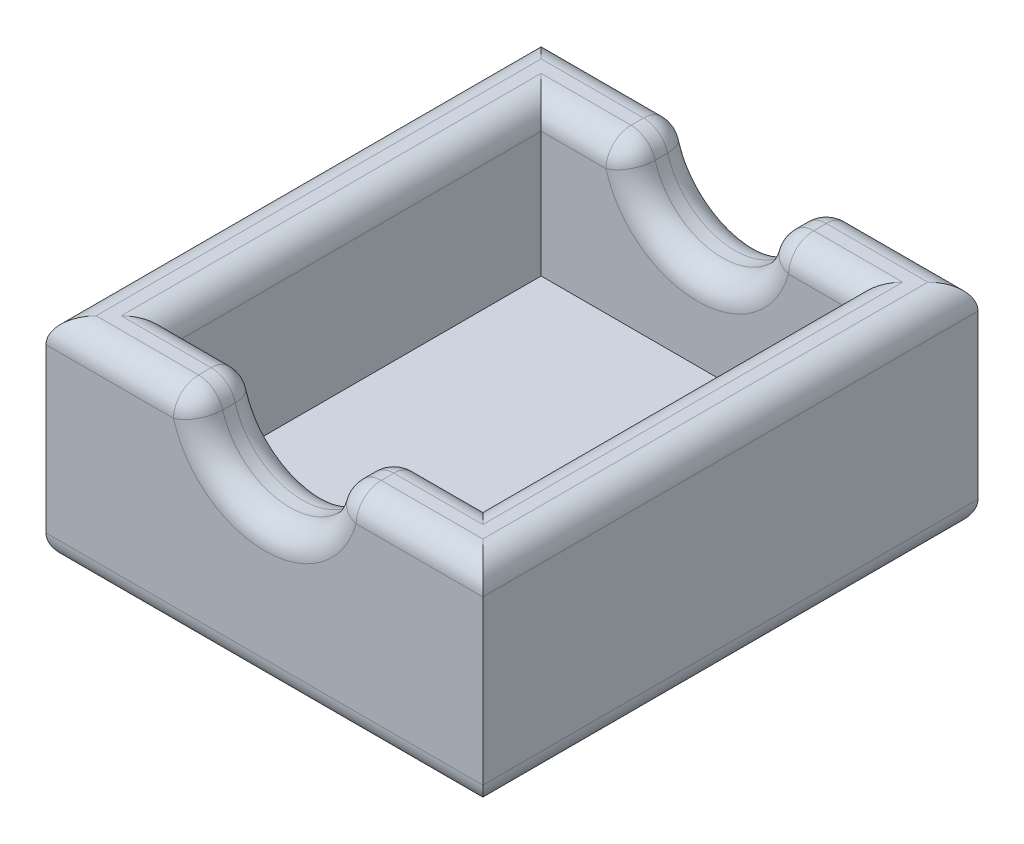
ISO-10303-21;
HEADER;
FILE_DESCRIPTION(('STEP AP214'),'2;1');
FILE_NAME('part.step','',(''),(''),'','','');
FILE_SCHEMA(('AUTOMOTIVE_DESIGN { 1 0 10303 214 1 1 1 1 }'));
ENDSEC;
DATA;
#1=APPLICATION_CONTEXT('core data for automotive mechanical design processes');
#2=APPLICATION_PROTOCOL_DEFINITION('international standard','automotive_design',2000,#1);
#3=PRODUCT_CONTEXT('',#1,'mechanical');
#4=PRODUCT('Part','Part','',(#3));
#5=PRODUCT_RELATED_PRODUCT_CATEGORY('part','',(#4));
#6=PRODUCT_DEFINITION_FORMATION('','',#4);
#7=PRODUCT_DEFINITION_CONTEXT('part definition',#1,'design');
#8=PRODUCT_DEFINITION('design','',#6,#7);
#9=PRODUCT_DEFINITION_SHAPE('','',#8);
#10=(LENGTH_UNIT() NAMED_UNIT(*) SI_UNIT(.MILLI.,.METRE.));
#11=(NAMED_UNIT(*) PLANE_ANGLE_UNIT() SI_UNIT($,.RADIAN.));
#12=(NAMED_UNIT(*) SI_UNIT($,.STERADIAN.) SOLID_ANGLE_UNIT());
#13=UNCERTAINTY_MEASURE_WITH_UNIT(LENGTH_MEASURE(1.E-05),#10,'distance_accuracy_value','');
#14=(GEOMETRIC_REPRESENTATION_CONTEXT(3) GLOBAL_UNCERTAINTY_ASSIGNED_CONTEXT((#13)) GLOBAL_UNIT_ASSIGNED_CONTEXT((#10,
#11,#12)) REPRESENTATION_CONTEXT('',''));
#15=CARTESIAN_POINT('',(0.,0.,0.));
#16=DIRECTION('',(0.,0.,1.));
#17=DIRECTION('',(1.,0.,0.));
#18=AXIS2_PLACEMENT_3D('',#15,#16,#17);
#19=CARTESIAN_POINT('',(0.,12.,0.));
#20=DIRECTION('',(0.,-1.,0.));
#21=DIRECTION('',(0.,0.,-1.));
#22=AXIS2_PLACEMENT_3D('',#19,#20,#21);
#23=PLANE('',#22);
#24=DIRECTION('',(1.,0.,0.));
#25=VECTOR('',#24,1.);
#26=CARTESIAN_POINT('',(0.,12.,31.5));
#27=LINE('',#26,#25);
#28=CARTESIAN_POINT('',(26.85,12.,31.5));
#29=VERTEX_POINT('',#28);
#30=CARTESIAN_POINT('',(19.7448525608543,12.,31.5));
#31=VERTEX_POINT('',#30);
#32=EDGE_CURVE('E307',#29,#31,#27,.F.);
#33=ORIENTED_EDGE('',*,*,#32,.T.);
#34=DIRECTION('',(0.,0.,1.));
#35=VECTOR('',#34,1.);
#36=CARTESIAN_POINT('',(19.7448525608543,12.,0.));
#37=LINE('',#36,#35);
#38=CARTESIAN_POINT('',(19.7448525608543,12.,32.5));
#39=VERTEX_POINT('',#38);
#40=EDGE_CURVE('E406',#31,#39,#37,.T.);
#41=ORIENTED_EDGE('',*,*,#40,.T.);
#42=DIRECTION('',(1.,0.,0.));
#43=VECTOR('',#42,1.);
#44=CARTESIAN_POINT('',(0.,12.,32.5));
#45=LINE('',#44,#43);
#46=CARTESIAN_POINT('',(27.85,12.,32.5));
#47=VERTEX_POINT('',#46);
#48=EDGE_CURVE('E286',#39,#47,#45,.T.);
#49=ORIENTED_EDGE('',*,*,#48,.T.);
#50=DIRECTION('',(0.,0.,-1.));
#51=VECTOR('',#50,1.);
#52=CARTESIAN_POINT('',(27.85,12.,0.));
#53=LINE('',#52,#51);
#54=CARTESIAN_POINT('',(27.85,12.,-3.));
#55=VERTEX_POINT('',#54);
#56=EDGE_CURVE('E291',#47,#55,#53,.T.);
#57=ORIENTED_EDGE('',*,*,#56,.T.);
#58=DIRECTION('',(-1.,0.,0.));
#59=VECTOR('',#58,1.);
#60=CARTESIAN_POINT('',(0.,12.,-3.));
#61=LINE('',#60,#59);
#62=CARTESIAN_POINT('',(19.7448525608543,12.,-3.));
#63=VERTEX_POINT('',#62);
#64=EDGE_CURVE('E279',#55,#63,#61,.T.);
#65=ORIENTED_EDGE('',*,*,#64,.T.);
#66=DIRECTION('',(0.,0.,1.));
#67=VECTOR('',#66,1.);
#68=CARTESIAN_POINT('',(19.7448525608543,12.,0.));
#69=LINE('',#68,#67);
#70=CARTESIAN_POINT('',(19.7448525608543,12.,-2.));
#71=VERTEX_POINT('',#70);
#72=EDGE_CURVE('E403',#63,#71,#69,.T.);
#73=ORIENTED_EDGE('',*,*,#72,.T.);
#74=DIRECTION('',(-1.,0.,0.));
#75=VECTOR('',#74,1.);
#76=CARTESIAN_POINT('',(24.85,12.,-2.));
#77=LINE('',#76,#75);
#78=CARTESIAN_POINT('',(26.85,12.,-2.));
#79=VERTEX_POINT('',#78);
#80=EDGE_CURVE('E298',#71,#79,#77,.F.);
#81=ORIENTED_EDGE('',*,*,#80,.T.);
#82=DIRECTION('',(0.,0.,-1.));
#83=VECTOR('',#82,1.);
#84=CARTESIAN_POINT('',(26.85,12.,29.5));
#85=LINE('',#84,#83);
#86=EDGE_CURVE('E303',#79,#29,#85,.F.);
#87=ORIENTED_EDGE('',*,*,#86,.T.);
#88=EDGE_LOOP('',(#33,#41,#49,#57,#65,#73,#81,#87));
#89=FACE_BOUND('',#88,.T.);
#90=ADVANCED_FACE('F41',(#89),#23,.F.);
#91=CARTESIAN_POINT('',(0.,10.,-2.));
#92=DIRECTION('',(1.,0.,0.));
#93=DIRECTION('',(0.,0.,-1.));
#94=AXIS2_PLACEMENT_3D('',#91,#92,#93);
#95=CYLINDRICAL_SURFACE('',#94,2.);
#96=ORIENTED_EDGE('',*,*,#80,.F.);
#97=CARTESIAN_POINT('',(19.7448525608543,10.,-2.));
#98=DIRECTION('',(1.,0.,0.));
#99=DIRECTION('',(0.,0.,-1.));
#100=AXIS2_PLACEMENT_3D('',#97,#98,#99);
#101=CIRCLE('',#100,2.);
#102=CARTESIAN_POINT('',(19.7448525608543,10.,0.));
#103=VERTEX_POINT('',#102);
#104=EDGE_CURVE('E432',#71,#103,#101,.T.);
#105=ORIENTED_EDGE('',*,*,#104,.T.);
#106=DIRECTION('',(-1.,0.,0.));
#107=VECTOR('',#106,1.);
#108=CARTESIAN_POINT('',(0.,10.,0.));
#109=LINE('',#108,#107);
#110=CARTESIAN_POINT('',(24.85,10.,0.));
#111=VERTEX_POINT('',#110);
#112=EDGE_CURVE('E314',#111,#103,#109,.T.);
#113=ORIENTED_EDGE('',*,*,#112,.F.);
#114=CARTESIAN_POINT('',(26.85,10.,-2.));
#115=DIRECTION('',(0.707106781186548,0.,0.707106781186547));
#116=DIRECTION('',(-0.707106781186547,0.,0.707106781186548));
#117=AXIS2_PLACEMENT_3D('',#114,#115,#116);
#118=ELLIPSE('',#117,2.82842712474619,2.);
#119=EDGE_CURVE('E347',#79,#111,#118,.T.);
#120=ORIENTED_EDGE('',*,*,#119,.F.);
#121=EDGE_LOOP('',(#96,#105,#113,#120));
#122=FACE_BOUND('',#121,.T.);
#123=ADVANCED_FACE('F644',(#122),#95,.T.);
#124=CARTESIAN_POINT('',(0.,10.,31.5));
#125=DIRECTION('',(-1.,0.,0.));
#126=DIRECTION('',(0.,0.,1.));
#127=AXIS2_PLACEMENT_3D('',#124,#125,#126);
#128=CYLINDRICAL_SURFACE('',#127,2.);
#129=CARTESIAN_POINT('',(5.17140882475201,12.,31.5));
#130=VERTEX_POINT('',#129);
#131=CARTESIAN_POINT('',(-1.99999999999999,12.,31.5));
#132=VERTEX_POINT('',#131);
#133=EDGE_CURVE('E306',#130,#132,#27,.F.);
#134=ORIENTED_EDGE('',*,*,#133,.F.);
#135=CARTESIAN_POINT('',(5.17140882475201,10.,31.5));
#136=DIRECTION('',(-1.,0.,0.));
#137=DIRECTION('',(0.,0.,1.));
#138=AXIS2_PLACEMENT_3D('',#135,#136,#137);
#139=CIRCLE('',#138,2.);
#140=CARTESIAN_POINT('',(5.17140882475201,10.,29.5));
#141=VERTEX_POINT('',#140);
#142=EDGE_CURVE('E394',#130,#141,#139,.T.);
#143=ORIENTED_EDGE('',*,*,#142,.T.);
#144=DIRECTION('',(1.,0.,0.));
#145=VECTOR('',#144,1.);
#146=CARTESIAN_POINT('',(24.85,10.,29.5));
#147=LINE('',#146,#145);
#148=CARTESIAN_POINT('',(0.,10.,29.5));
#149=VERTEX_POINT('',#148);
#150=EDGE_CURVE('E274',#149,#141,#147,.T.);
#151=ORIENTED_EDGE('',*,*,#150,.F.);
#152=CARTESIAN_POINT('',(-1.99999999999999,10.,31.5));
#153=DIRECTION('',(-0.707106781186548,0.,-0.707106781186547));
#154=DIRECTION('',(-0.707106781186547,0.,0.707106781186548));
#155=AXIS2_PLACEMENT_3D('',#152,#153,#154);
#156=ELLIPSE('',#155,2.82842712474619,2.);
#157=EDGE_CURVE('E342',#149,#132,#156,.F.);
#158=ORIENTED_EDGE('',*,*,#157,.T.);
#159=EDGE_LOOP('',(#134,#143,#151,#158));
#160=FACE_BOUND('',#159,.T.);
#161=ADVANCED_FACE('F688',(#160),#128,.T.);
#162=CARTESIAN_POINT('',(0.,10.,32.5));
#163=DIRECTION('',(1.,0.,0.));
#164=DIRECTION('',(0.,0.,-1.));
#165=AXIS2_PLACEMENT_3D('',#162,#163,#164);
#166=CYLINDRICAL_SURFACE('',#165,2.);
#167=ORIENTED_EDGE('',*,*,#48,.F.);
#168=CARTESIAN_POINT('',(19.7448525608543,10.,32.5));
#169=DIRECTION('',(1.,0.,0.));
#170=DIRECTION('',(0.,0.,-1.));
#171=AXIS2_PLACEMENT_3D('',#168,#169,#170);
#172=CIRCLE('',#171,2.);
#173=CARTESIAN_POINT('',(19.7448525608543,10.,34.5));
#174=VERTEX_POINT('',#173);
#175=EDGE_CURVE('E409',#39,#174,#172,.T.);
#176=ORIENTED_EDGE('',*,*,#175,.T.);
#177=DIRECTION('',(1.,0.,0.));
#178=VECTOR('',#177,1.);
#179=CARTESIAN_POINT('',(-5.,10.,34.5));
#180=LINE('',#179,#178);
#181=CARTESIAN_POINT('',(29.85,10.,34.5));
#182=VERTEX_POINT('',#181);
#183=EDGE_CURVE('E325',#182,#174,#180,.F.);
#184=ORIENTED_EDGE('',*,*,#183,.F.);
#185=CARTESIAN_POINT('',(27.85,10.,32.5));
#186=DIRECTION('',(0.707106781186547,0.,-0.707106781186548));
#187=DIRECTION('',(0.707106781186548,0.,0.707106781186547));
#188=AXIS2_PLACEMENT_3D('',#185,#186,#187);
#189=ELLIPSE('',#188,2.82842712474619,2.);
#190=EDGE_CURVE('E358',#47,#182,#189,.T.);
#191=ORIENTED_EDGE('',*,*,#190,.F.);
#192=EDGE_LOOP('',(#167,#176,#184,#191));
#193=FACE_BOUND('',#192,.T.);
#194=ADVANCED_FACE('F577',(#193),#166,.T.);
#195=CARTESIAN_POINT('',(0.,10.,-3.));
#196=DIRECTION('',(-1.,0.,0.));
#197=DIRECTION('',(0.,0.,1.));
#198=AXIS2_PLACEMENT_3D('',#195,#196,#197);
#199=CYLINDRICAL_SURFACE('',#198,2.);
#200=CARTESIAN_POINT('',(5.17140882475201,12.,-3.));
#201=VERTEX_POINT('',#200);
#202=CARTESIAN_POINT('',(-3.,12.,-3.));
#203=VERTEX_POINT('',#202);
#204=EDGE_CURVE('E278',#201,#203,#61,.T.);
#205=ORIENTED_EDGE('',*,*,#204,.F.);
#206=CARTESIAN_POINT('',(5.17140882475201,10.,-3.));
#207=DIRECTION('',(-1.,0.,0.));
#208=DIRECTION('',(0.,0.,1.));
#209=AXIS2_PLACEMENT_3D('',#206,#207,#208);
#210=CIRCLE('',#209,2.);
#211=CARTESIAN_POINT('',(5.17140882475201,10.,-5.));
#212=VERTEX_POINT('',#211);
#213=EDGE_CURVE('E441',#201,#212,#210,.T.);
#214=ORIENTED_EDGE('',*,*,#213,.T.);
#215=DIRECTION('',(-1.,0.,0.));
#216=VECTOR('',#215,1.);
#217=CARTESIAN_POINT('',(-5.,10.,-5.));
#218=LINE('',#217,#216);
#219=CARTESIAN_POINT('',(-5.,10.,-5.));
#220=VERTEX_POINT('',#219);
#221=EDGE_CURVE('E333',#220,#212,#218,.F.);
#222=ORIENTED_EDGE('',*,*,#221,.F.);
#223=CARTESIAN_POINT('',(-3.,10.,-3.));
#224=DIRECTION('',(-0.707106781186547,0.,0.707106781186548));
#225=DIRECTION('',(-0.707106781186547,0.,-0.707106781186547));
#226=AXIS2_PLACEMENT_3D('',#223,#224,#225);
#227=ELLIPSE('',#226,2.82842712474619,2.);
#228=EDGE_CURVE('E362',#220,#203,#227,.F.);
#229=ORIENTED_EDGE('',*,*,#228,.T.);
#230=EDGE_LOOP('',(#205,#214,#222,#229));
#231=FACE_BOUND('',#230,.T.);
#232=ADVANCED_FACE('F721',(#231),#199,.T.);
#233=CARTESIAN_POINT('',(-3.,12.,32.5));
#234=VERTEX_POINT('',#233);
#235=CARTESIAN_POINT('',(5.17140882475201,12.,32.5));
#236=VERTEX_POINT('',#235);
#237=EDGE_CURVE('E287',#234,#236,#45,.T.);
#238=ORIENTED_EDGE('',*,*,#237,.T.);
#239=DIRECTION('',(0.,0.,1.));
#240=VECTOR('',#239,1.);
#241=CARTESIAN_POINT('',(5.17140882475201,12.,0.));
#242=LINE('',#241,#240);
#243=EDGE_CURVE('E391',#236,#130,#242,.F.);
#244=ORIENTED_EDGE('',*,*,#243,.T.);
#245=ORIENTED_EDGE('',*,*,#133,.T.);
#246=DIRECTION('',(0.,0.,1.));
#247=VECTOR('',#246,1.);
#248=CARTESIAN_POINT('',(-2.,12.,0.));
#249=LINE('',#248,#247);
#250=CARTESIAN_POINT('',(-2.,12.,-2.));
#251=VERTEX_POINT('',#250);
#252=EDGE_CURVE('E295',#132,#251,#249,.F.);
#253=ORIENTED_EDGE('',*,*,#252,.T.);
#254=CARTESIAN_POINT('',(5.17140882475201,12.,-2.));
#255=VERTEX_POINT('',#254);
#256=EDGE_CURVE('E299',#251,#255,#77,.F.);
#257=ORIENTED_EDGE('',*,*,#256,.T.);
#258=DIRECTION('',(0.,0.,1.));
#259=VECTOR('',#258,1.);
#260=CARTESIAN_POINT('',(5.17140882475201,12.,0.));
#261=LINE('',#260,#259);
#262=EDGE_CURVE('E388',#255,#201,#261,.F.);
#263=ORIENTED_EDGE('',*,*,#262,.T.);
#264=ORIENTED_EDGE('',*,*,#204,.T.);
#265=DIRECTION('',(0.,0.,1.));
#266=VECTOR('',#265,1.);
#267=CARTESIAN_POINT('',(-3.,12.,0.));
#268=LINE('',#267,#266);
#269=EDGE_CURVE('E283',#203,#234,#268,.T.);
#270=ORIENTED_EDGE('',*,*,#269,.T.);
#271=EDGE_LOOP('',(#238,#244,#245,#253,#257,#263,#264,#270));
#272=FACE_BOUND('',#271,.T.);
#273=ADVANCED_FACE('F608',(#272),#23,.F.);
#274=CARTESIAN_POINT('',(-5.,12.,-5.));
#275=DIRECTION('',(0.,0.,1.));
#276=DIRECTION('',(1.,0.,0.));
#277=AXIS2_PLACEMENT_3D('',#274,#275,#276);
#278=PLANE('',#277);
#279=DIRECTION('',(0.,-1.,0.));
#280=VECTOR('',#279,1.);
#281=CARTESIAN_POINT('',(29.85,12.,-5.));
#282=LINE('',#281,#280);
#283=CARTESIAN_POINT('',(29.85,10.,-5.));
#284=VERTEX_POINT('',#283);
#285=CARTESIAN_POINT('',(29.85,-3.,-5.));
#286=VERTEX_POINT('',#285);
#287=EDGE_CURVE('E260',#284,#286,#282,.T.);
#288=ORIENTED_EDGE('',*,*,#287,.T.);
#289=DIRECTION('',(-1.,0.,0.));
#290=VECTOR('',#289,1.);
#291=CARTESIAN_POINT('',(-5.,-3.,-5.));
#292=LINE('',#291,#290);
#293=CARTESIAN_POINT('',(-5.,-3.,-5.));
#294=VERTEX_POINT('',#293);
#295=EDGE_CURVE('E51',#286,#294,#292,.T.);
#296=ORIENTED_EDGE('',*,*,#295,.T.);
#297=DIRECTION('',(0.,-1.,0.));
#298=VECTOR('',#297,1.);
#299=CARTESIAN_POINT('',(-5.,12.,-5.));
#300=LINE('',#299,#298);
#301=EDGE_CURVE('E270',#220,#294,#300,.T.);
#302=ORIENTED_EDGE('',*,*,#301,.F.);
#303=ORIENTED_EDGE('',*,*,#221,.T.);
#304=CARTESIAN_POINT('',(12.4581306928032,12.0554702604343,-5.));
#305=DIRECTION('',(0.,0.,1.));
#306=DIRECTION('',(1.,0.,0.));
#307=AXIS2_PLACEMENT_3D('',#304,#305,#306);
#308=CIRCLE('',#307,7.57108140055731);
#309=CARTESIAN_POINT('',(19.7448525608543,10.,-5.));
#310=VERTEX_POINT('',#309);
#311=EDGE_CURVE('E412',#212,#310,#308,.T.);
#312=ORIENTED_EDGE('',*,*,#311,.T.);
#313=EDGE_CURVE('E332',#310,#284,#218,.F.);
#314=ORIENTED_EDGE('',*,*,#313,.T.);
#315=EDGE_LOOP('',(#288,#296,#302,#303,#312,#314));
#316=FACE_BOUND('',#315,.T.);
#317=ADVANCED_FACE('F620',(#316),#278,.F.);
#318=CARTESIAN_POINT('',(-5.,12.,-5.));
#319=DIRECTION('',(1.,0.,0.));
#320=DIRECTION('',(0.,0.,-1.));
#321=AXIS2_PLACEMENT_3D('',#318,#319,#320);
#322=PLANE('',#321);
#323=ORIENTED_EDGE('',*,*,#301,.T.);
#324=DIRECTION('',(0.,0.,1.));
#325=VECTOR('',#324,1.);
#326=CARTESIAN_POINT('',(-5.,-3.,-5.));
#327=LINE('',#326,#325);
#328=CARTESIAN_POINT('',(-5.,-3.,34.5));
#329=VERTEX_POINT('',#328);
#330=EDGE_CURVE('E11',#294,#329,#327,.T.);
#331=ORIENTED_EDGE('',*,*,#330,.T.);
#332=DIRECTION('',(0.,-1.,0.));
#333=VECTOR('',#332,1.);
#334=CARTESIAN_POINT('',(-5.,12.,34.5));
#335=LINE('',#334,#333);
#336=CARTESIAN_POINT('',(-5.,10.,34.5));
#337=VERTEX_POINT('',#336);
#338=EDGE_CURVE('E266',#337,#329,#335,.T.);
#339=ORIENTED_EDGE('',*,*,#338,.F.);
#340=DIRECTION('',(0.,0.,1.));
#341=VECTOR('',#340,1.);
#342=CARTESIAN_POINT('',(-5.,10.,-5.));
#343=LINE('',#342,#341);
#344=EDGE_CURVE('E329',#337,#220,#343,.F.);
#345=ORIENTED_EDGE('',*,*,#344,.T.);
#346=EDGE_LOOP('',(#323,#331,#339,#345));
#347=FACE_BOUND('',#346,.T.);
#348=ADVANCED_FACE('F619',(#347),#322,.F.);
#349=CARTESIAN_POINT('',(-5.,12.,34.5));
#350=DIRECTION('',(0.,0.,-1.));
#351=DIRECTION('',(-1.,0.,0.));
#352=AXIS2_PLACEMENT_3D('',#349,#350,#351);
#353=PLANE('',#352);
#354=ORIENTED_EDGE('',*,*,#338,.T.);
#355=DIRECTION('',(1.,0.,0.));
#356=VECTOR('',#355,1.);
#357=CARTESIAN_POINT('',(-5.,-3.,34.5));
#358=LINE('',#357,#356);
#359=CARTESIAN_POINT('',(29.85,-3.,34.5));
#360=VERTEX_POINT('',#359);
#361=EDGE_CURVE('E444',#329,#360,#358,.T.);
#362=ORIENTED_EDGE('',*,*,#361,.T.);
#363=DIRECTION('',(0.,-1.,0.));
#364=VECTOR('',#363,1.);
#365=CARTESIAN_POINT('',(29.85,12.,34.5));
#366=LINE('',#365,#364);
#367=EDGE_CURVE('E263',#182,#360,#366,.T.);
#368=ORIENTED_EDGE('',*,*,#367,.F.);
#369=ORIENTED_EDGE('',*,*,#183,.T.);
#370=CARTESIAN_POINT('',(12.4581306928032,12.0554702604343,34.5));
#371=DIRECTION('',(0.,0.,-1.));
#372=DIRECTION('',(-1.,0.,0.));
#373=AXIS2_PLACEMENT_3D('',#370,#371,#372);
#374=CIRCLE('',#373,7.57108140055731);
#375=CARTESIAN_POINT('',(5.17140882475201,10.,34.5));
#376=VERTEX_POINT('',#375);
#377=EDGE_CURVE('E381',#174,#376,#374,.T.);
#378=ORIENTED_EDGE('',*,*,#377,.T.);
#379=EDGE_CURVE('E324',#376,#337,#180,.F.);
#380=ORIENTED_EDGE('',*,*,#379,.T.);
#381=EDGE_LOOP('',(#354,#362,#368,#369,#378,#380));
#382=FACE_BOUND('',#381,.T.);
#383=ADVANCED_FACE('F555',(#382),#353,.F.);
#384=CARTESIAN_POINT('',(29.85,12.,-5.));
#385=DIRECTION('',(-1.,0.,0.));
#386=DIRECTION('',(0.,0.,1.));
#387=AXIS2_PLACEMENT_3D('',#384,#385,#386);
#388=PLANE('',#387);
#389=ORIENTED_EDGE('',*,*,#367,.T.);
#390=DIRECTION('',(0.,0.,-1.));
#391=VECTOR('',#390,1.);
#392=CARTESIAN_POINT('',(29.85,-3.,-5.));
#393=LINE('',#392,#391);
#394=EDGE_CURVE('E66',#360,#286,#393,.T.);
#395=ORIENTED_EDGE('',*,*,#394,.T.);
#396=ORIENTED_EDGE('',*,*,#287,.F.);
#397=DIRECTION('',(0.,0.,-1.));
#398=VECTOR('',#397,1.);
#399=CARTESIAN_POINT('',(29.85,10.,-5.));
#400=LINE('',#399,#398);
#401=EDGE_CURVE('E320',#284,#182,#400,.F.);
#402=ORIENTED_EDGE('',*,*,#401,.T.);
#403=EDGE_LOOP('',(#389,#395,#396,#402));
#404=FACE_BOUND('',#403,.T.);
#405=ADVANCED_FACE('F557',(#404),#388,.F.);
#406=CARTESIAN_POINT('',(0.,12.,0.));
#407=DIRECTION('',(1.,0.,0.));
#408=DIRECTION('',(0.,0.,-1.));
#409=AXIS2_PLACEMENT_3D('',#406,#407,#408);
#410=PLANE('',#409);
#411=DIRECTION('',(0.,-1.,0.));
#412=VECTOR('',#411,1.);
#413=CARTESIAN_POINT('',(0.,12.,0.));
#414=LINE('',#413,#412);
#415=CARTESIAN_POINT('',(0.,10.,0.));
#416=VERTEX_POINT('',#415);
#417=CARTESIAN_POINT('',(0.,0.,0.));
#418=VERTEX_POINT('',#417);
#419=EDGE_CURVE('E225',#416,#418,#414,.T.);
#420=ORIENTED_EDGE('',*,*,#419,.F.);
#421=DIRECTION('',(0.,0.,1.));
#422=VECTOR('',#421,1.);
#423=CARTESIAN_POINT('',(0.,10.,29.5));
#424=LINE('',#423,#422);
#425=EDGE_CURVE('E317',#416,#149,#424,.T.);
#426=ORIENTED_EDGE('',*,*,#425,.T.);
#427=DIRECTION('',(0.,-1.,0.));
#428=VECTOR('',#427,1.);
#429=CARTESIAN_POINT('',(0.,12.,29.5));
#430=LINE('',#429,#428);
#431=CARTESIAN_POINT('',(0.,0.,29.5));
#432=VERTEX_POINT('',#431);
#433=EDGE_CURVE('E257',#149,#432,#430,.T.);
#434=ORIENTED_EDGE('',*,*,#433,.T.);
#435=DIRECTION('',(0.,0.,1.));
#436=VECTOR('',#435,1.);
#437=CARTESIAN_POINT('',(0.,0.,0.));
#438=LINE('',#437,#436);
#439=EDGE_CURVE('E249',#418,#432,#438,.T.);
#440=ORIENTED_EDGE('',*,*,#439,.F.);
#441=EDGE_LOOP('',(#420,#426,#434,#440));
#442=FACE_BOUND('',#441,.T.);
#443=ADVANCED_FACE('F958',(#442),#410,.T.);
#444=CARTESIAN_POINT('',(0.,12.,29.5));
#445=DIRECTION('',(0.,0.,-1.));
#446=DIRECTION('',(-1.,0.,0.));
#447=AXIS2_PLACEMENT_3D('',#444,#445,#446);
#448=PLANE('',#447);
#449=ORIENTED_EDGE('',*,*,#150,.T.);
#450=CARTESIAN_POINT('',(12.4581306928032,12.0554702604343,29.5));
#451=DIRECTION('',(0.,0.,-1.));
#452=DIRECTION('',(-1.,0.,0.));
#453=AXIS2_PLACEMENT_3D('',#450,#451,#452);
#454=CIRCLE('',#453,7.57108140055731);
#455=CARTESIAN_POINT('',(19.7448525608543,10.,29.5));
#456=VERTEX_POINT('',#455);
#457=EDGE_CURVE('E397',#141,#456,#454,.F.);
#458=ORIENTED_EDGE('',*,*,#457,.T.);
#459=CARTESIAN_POINT('',(24.85,10.,29.5));
#460=VERTEX_POINT('',#459);
#461=EDGE_CURVE('E273',#456,#460,#147,.T.);
#462=ORIENTED_EDGE('',*,*,#461,.T.);
#463=DIRECTION('',(0.,-1.,0.));
#464=VECTOR('',#463,1.);
#465=CARTESIAN_POINT('',(24.85,12.,29.5));
#466=LINE('',#465,#464);
#467=CARTESIAN_POINT('',(24.85,0.,29.5));
#468=VERTEX_POINT('',#467);
#469=EDGE_CURVE('E241',#460,#468,#466,.T.);
#470=ORIENTED_EDGE('',*,*,#469,.T.);
#471=DIRECTION('',(1.,0.,0.));
#472=VECTOR('',#471,1.);
#473=CARTESIAN_POINT('',(0.,0.,29.5));
#474=LINE('',#473,#472);
#475=EDGE_CURVE('E245',#432,#468,#474,.T.);
#476=ORIENTED_EDGE('',*,*,#475,.F.);
#477=ORIENTED_EDGE('',*,*,#433,.F.);
#478=EDGE_LOOP('',(#449,#458,#462,#470,#476,#477));
#479=FACE_BOUND('',#478,.T.);
#480=ADVANCED_FACE('F668',(#479),#448,.T.);
#481=CARTESIAN_POINT('',(24.85,12.,0.));
#482=DIRECTION('',(-1.,0.,0.));
#483=DIRECTION('',(0.,0.,1.));
#484=AXIS2_PLACEMENT_3D('',#481,#482,#483);
#485=PLANE('',#484);
#486=ORIENTED_EDGE('',*,*,#469,.F.);
#487=DIRECTION('',(0.,0.,-1.));
#488=VECTOR('',#487,1.);
#489=CARTESIAN_POINT('',(24.85,10.,0.));
#490=LINE('',#489,#488);
#491=EDGE_CURVE('E239',#460,#111,#490,.T.);
#492=ORIENTED_EDGE('',*,*,#491,.T.);
#493=DIRECTION('',(0.,-1.,0.));
#494=VECTOR('',#493,1.);
#495=CARTESIAN_POINT('',(24.85,12.,0.));
#496=LINE('',#495,#494);
#497=CARTESIAN_POINT('',(24.85,0.,0.));
#498=VERTEX_POINT('',#497);
#499=EDGE_CURVE('E222',#111,#498,#496,.T.);
#500=ORIENTED_EDGE('',*,*,#499,.T.);
#501=DIRECTION('',(0.,0.,-1.));
#502=VECTOR('',#501,1.);
#503=CARTESIAN_POINT('',(24.85,0.,0.));
#504=LINE('',#503,#502);
#505=EDGE_CURVE('E231',#468,#498,#504,.T.);
#506=ORIENTED_EDGE('',*,*,#505,.F.);
#507=EDGE_LOOP('',(#486,#492,#500,#506));
#508=FACE_BOUND('',#507,.T.);
#509=ADVANCED_FACE('F236',(#508),#485,.T.);
#510=CARTESIAN_POINT('',(0.,12.,0.));
#511=DIRECTION('',(0.,0.,1.));
#512=DIRECTION('',(1.,0.,0.));
#513=AXIS2_PLACEMENT_3D('',#510,#511,#512);
#514=PLANE('',#513);
#515=ORIENTED_EDGE('',*,*,#112,.T.);
#516=CARTESIAN_POINT('',(12.4581306928032,12.0554702604343,0.));
#517=DIRECTION('',(0.,0.,1.));
#518=DIRECTION('',(1.,0.,0.));
#519=AXIS2_PLACEMENT_3D('',#516,#517,#518);
#520=CIRCLE('',#519,7.57108140055731);
#521=CARTESIAN_POINT('',(5.17140882475201,10.,0.));
#522=VERTEX_POINT('',#521);
#523=EDGE_CURVE('E435',#103,#522,#520,.F.);
#524=ORIENTED_EDGE('',*,*,#523,.T.);
#525=EDGE_CURVE('E313',#522,#416,#109,.T.);
#526=ORIENTED_EDGE('',*,*,#525,.T.);
#527=ORIENTED_EDGE('',*,*,#419,.T.);
#528=DIRECTION('',(-1.,0.,0.));
#529=VECTOR('',#528,1.);
#530=CARTESIAN_POINT('',(0.,0.,0.));
#531=LINE('',#530,#529);
#532=EDGE_CURVE('E218',#498,#418,#531,.T.);
#533=ORIENTED_EDGE('',*,*,#532,.F.);
#534=ORIENTED_EDGE('',*,*,#499,.F.);
#535=EDGE_LOOP('',(#515,#524,#526,#527,#533,#534));
#536=FACE_BOUND('',#535,.T.);
#537=ADVANCED_FACE('F221',(#536),#514,.T.);
#538=ORIENTED_EDGE('',*,*,#525,.F.);
#539=CARTESIAN_POINT('',(5.17140882475201,10.,-2.));
#540=DIRECTION('',(1.,0.,0.));
#541=DIRECTION('',(0.,0.,-1.));
#542=AXIS2_PLACEMENT_3D('',#539,#540,#541);
#543=CIRCLE('',#542,2.);
#544=EDGE_CURVE('E438',#522,#255,#543,.F.);
#545=ORIENTED_EDGE('',*,*,#544,.T.);
#546=ORIENTED_EDGE('',*,*,#256,.F.);
#547=CARTESIAN_POINT('',(-2.,10.,-2.));
#548=DIRECTION('',(0.707106781186547,0.,-0.707106781186548));
#549=DIRECTION('',(0.707106781186548,0.,0.707106781186547));
#550=AXIS2_PLACEMENT_3D('',#547,#548,#549);
#551=ELLIPSE('',#550,2.82842712474619,2.);
#552=EDGE_CURVE('E351',#416,#251,#551,.F.);
#553=ORIENTED_EDGE('',*,*,#552,.F.);
#554=EDGE_LOOP('',(#538,#545,#546,#553));
#555=FACE_BOUND('',#554,.T.);
#556=ADVANCED_FACE('F659',(#555),#95,.T.);
#557=CARTESIAN_POINT('',(-2.,10.,0.));
#558=DIRECTION('',(0.,0.,-1.));
#559=DIRECTION('',(-1.,0.,0.));
#560=AXIS2_PLACEMENT_3D('',#557,#558,#559);
#561=CYLINDRICAL_SURFACE('',#560,2.);
#562=ORIENTED_EDGE('',*,*,#552,.T.);
#563=ORIENTED_EDGE('',*,*,#252,.F.);
#564=ORIENTED_EDGE('',*,*,#157,.F.);
#565=ORIENTED_EDGE('',*,*,#425,.F.);
#566=EDGE_LOOP('',(#562,#563,#564,#565));
#567=FACE_BOUND('',#566,.T.);
#568=ADVANCED_FACE('F694',(#567),#561,.T.);
#569=CARTESIAN_POINT('',(26.85,10.,0.));
#570=DIRECTION('',(0.,0.,1.));
#571=DIRECTION('',(1.,0.,0.));
#572=AXIS2_PLACEMENT_3D('',#569,#570,#571);
#573=CYLINDRICAL_SURFACE('',#572,2.);
#574=ORIENTED_EDGE('',*,*,#119,.T.);
#575=ORIENTED_EDGE('',*,*,#491,.F.);
#576=CARTESIAN_POINT('',(26.85,10.,31.5));
#577=DIRECTION('',(-0.707106781186547,0.,0.707106781186548));
#578=DIRECTION('',(-0.707106781186548,0.,-0.707106781186547));
#579=AXIS2_PLACEMENT_3D('',#576,#577,#578);
#580=ELLIPSE('',#579,2.82842712474619,2.);
#581=EDGE_CURVE('E338',#29,#460,#580,.T.);
#582=ORIENTED_EDGE('',*,*,#581,.F.);
#583=ORIENTED_EDGE('',*,*,#86,.F.);
#584=EDGE_LOOP('',(#574,#575,#582,#583));
#585=FACE_BOUND('',#584,.T.);
#586=ADVANCED_FACE('F676',(#585),#573,.T.);
#587=ORIENTED_EDGE('',*,*,#461,.F.);
#588=CARTESIAN_POINT('',(19.7448525608543,10.,31.5));
#589=DIRECTION('',(-1.,0.,0.));
#590=DIRECTION('',(0.,0.,1.));
#591=AXIS2_PLACEMENT_3D('',#588,#589,#590);
#592=CIRCLE('',#591,2.);
#593=EDGE_CURVE('E400',#456,#31,#592,.F.);
#594=ORIENTED_EDGE('',*,*,#593,.T.);
#595=ORIENTED_EDGE('',*,*,#32,.F.);
#596=ORIENTED_EDGE('',*,*,#581,.T.);
#597=EDGE_LOOP('',(#587,#594,#595,#596));
#598=FACE_BOUND('',#597,.T.);
#599=ADVANCED_FACE('F674',(#598),#128,.T.);
#600=CARTESIAN_POINT('',(-3.,10.,0.));
#601=DIRECTION('',(0.,0.,1.));
#602=DIRECTION('',(1.,0.,0.));
#603=AXIS2_PLACEMENT_3D('',#600,#601,#602);
#604=CYLINDRICAL_SURFACE('',#603,2.);
#605=ORIENTED_EDGE('',*,*,#228,.F.);
#606=ORIENTED_EDGE('',*,*,#344,.F.);
#607=CARTESIAN_POINT('',(-3.,10.,32.5));
#608=DIRECTION('',(0.707106781186547,0.,0.707106781186547));
#609=DIRECTION('',(-0.707106781186547,0.,0.707106781186548));
#610=AXIS2_PLACEMENT_3D('',#607,#608,#609);
#611=ELLIPSE('',#610,2.82842712474619,2.);
#612=EDGE_CURVE('E343',#234,#337,#611,.T.);
#613=ORIENTED_EDGE('',*,*,#612,.F.);
#614=ORIENTED_EDGE('',*,*,#269,.F.);
#615=EDGE_LOOP('',(#605,#606,#613,#614));
#616=FACE_BOUND('',#615,.T.);
#617=ADVANCED_FACE('F616',(#616),#604,.T.);
#618=ORIENTED_EDGE('',*,*,#379,.F.);
#619=CARTESIAN_POINT('',(5.17140882475201,10.,32.5));
#620=DIRECTION('',(1.,0.,0.));
#621=DIRECTION('',(0.,0.,-1.));
#622=AXIS2_PLACEMENT_3D('',#619,#620,#621);
#623=CIRCLE('',#622,2.);
#624=EDGE_CURVE('E385',#376,#236,#623,.F.);
#625=ORIENTED_EDGE('',*,*,#624,.T.);
#626=ORIENTED_EDGE('',*,*,#237,.F.);
#627=ORIENTED_EDGE('',*,*,#612,.T.);
#628=EDGE_LOOP('',(#618,#625,#626,#627));
#629=FACE_BOUND('',#628,.T.);
#630=ADVANCED_FACE('F606',(#629),#166,.T.);
#631=ORIENTED_EDGE('',*,*,#313,.F.);
#632=CARTESIAN_POINT('',(19.7448525608543,10.,-3.));
#633=DIRECTION('',(-1.,0.,0.));
#634=DIRECTION('',(0.,0.,1.));
#635=AXIS2_PLACEMENT_3D('',#632,#633,#634);
#636=CIRCLE('',#635,2.);
#637=EDGE_CURVE('E429',#310,#63,#636,.F.);
#638=ORIENTED_EDGE('',*,*,#637,.T.);
#639=ORIENTED_EDGE('',*,*,#64,.F.);
#640=CARTESIAN_POINT('',(27.85,10.,-3.));
#641=DIRECTION('',(-0.707106781186548,0.,-0.707106781186547));
#642=DIRECTION('',(-0.707106781186547,0.,0.707106781186548));
#643=AXIS2_PLACEMENT_3D('',#640,#641,#642);
#644=ELLIPSE('',#643,2.82842712474619,2.);
#645=EDGE_CURVE('E355',#284,#55,#644,.F.);
#646=ORIENTED_EDGE('',*,*,#645,.F.);
#647=EDGE_LOOP('',(#631,#638,#639,#646));
#648=FACE_BOUND('',#647,.T.);
#649=ADVANCED_FACE('F568',(#648),#199,.T.);
#650=CARTESIAN_POINT('',(27.85,10.,0.));
#651=DIRECTION('',(0.,0.,-1.));
#652=DIRECTION('',(-1.,0.,0.));
#653=AXIS2_PLACEMENT_3D('',#650,#651,#652);
#654=CYLINDRICAL_SURFACE('',#653,2.);
#655=ORIENTED_EDGE('',*,*,#190,.T.);
#656=ORIENTED_EDGE('',*,*,#401,.F.);
#657=ORIENTED_EDGE('',*,*,#645,.T.);
#658=ORIENTED_EDGE('',*,*,#56,.F.);
#659=EDGE_LOOP('',(#655,#656,#657,#658));
#660=FACE_BOUND('',#659,.T.);
#661=ADVANCED_FACE('F561',(#660),#654,.T.);
#662=CARTESIAN_POINT('',(12.4581306928032,12.0554702604343,-5.));
#663=DIRECTION('',(0.,0.,1.));
#664=DIRECTION('',(1.,0.,0.));
#665=AXIS2_PLACEMENT_3D('',#662,#663,#664);
#666=CYLINDRICAL_SURFACE('',#665,5.57108140055731);
#667=DIRECTION('',(0.,0.,1.));
#668=VECTOR('',#667,1.);
#669=CARTESIAN_POINT('',(17.819969843964,10.5429793055145,-5.));
#670=LINE('',#669,#668);
#671=CARTESIAN_POINT('',(17.819969843964,10.5429793055145,-2.));
#672=VERTEX_POINT('',#671);
#673=CARTESIAN_POINT('',(17.819969843964,10.5429793055145,-3.));
#674=VERTEX_POINT('',#673);
#675=EDGE_CURVE('E422',#672,#674,#670,.F.);
#676=ORIENTED_EDGE('',*,*,#675,.T.);
#677=CARTESIAN_POINT('',(12.4581306928032,12.0554702604343,-3.));
#678=DIRECTION('',(0.,0.,1.));
#679=DIRECTION('',(1.,0.,0.));
#680=AXIS2_PLACEMENT_3D('',#677,#678,#679);
#681=CIRCLE('',#680,5.57108140055731);
#682=CARTESIAN_POINT('',(7.0962915416423,10.5429793055145,-3.));
#683=VERTEX_POINT('',#682);
#684=EDGE_CURVE('E425',#674,#683,#681,.F.);
#685=ORIENTED_EDGE('',*,*,#684,.T.);
#686=DIRECTION('',(0.,0.,1.));
#687=VECTOR('',#686,1.);
#688=CARTESIAN_POINT('',(7.0962915416423,10.5429793055145,-5.));
#689=LINE('',#688,#687);
#690=CARTESIAN_POINT('',(7.0962915416423,10.5429793055145,-2.));
#691=VERTEX_POINT('',#690);
#692=EDGE_CURVE('E416',#683,#691,#689,.T.);
#693=ORIENTED_EDGE('',*,*,#692,.T.);
#694=CARTESIAN_POINT('',(12.4581306928032,12.0554702604343,-2.));
#695=DIRECTION('',(0.,0.,1.));
#696=DIRECTION('',(1.,0.,0.));
#697=AXIS2_PLACEMENT_3D('',#694,#695,#696);
#698=CIRCLE('',#697,5.57108140055731);
#699=EDGE_CURVE('E419',#691,#672,#698,.T.);
#700=ORIENTED_EDGE('',*,*,#699,.T.);
#701=EDGE_LOOP('',(#676,#685,#693,#700));
#702=FACE_BOUND('',#701,.T.);
#703=ADVANCED_FACE('F702',(#702),#666,.F.);
#704=DIRECTION('',(0.,0.,1.));
#705=VECTOR('',#704,1.);
#706=CARTESIAN_POINT('',(7.0962915416423,10.5429793055145,-5.));
#707=LINE('',#706,#705);
#708=CARTESIAN_POINT('',(7.0962915416423,10.5429793055145,31.5));
#709=VERTEX_POINT('',#708);
#710=CARTESIAN_POINT('',(7.0962915416423,10.5429793055145,32.5));
#711=VERTEX_POINT('',#710);
#712=EDGE_CURVE('E374',#709,#711,#707,.T.);
#713=ORIENTED_EDGE('',*,*,#712,.T.);
#714=CARTESIAN_POINT('',(12.4581306928032,12.0554702604343,32.5));
#715=DIRECTION('',(0.,0.,-1.));
#716=DIRECTION('',(-1.,0.,0.));
#717=AXIS2_PLACEMENT_3D('',#714,#715,#716);
#718=CIRCLE('',#717,5.57108140055731);
#719=CARTESIAN_POINT('',(17.819969843964,10.5429793055145,32.5));
#720=VERTEX_POINT('',#719);
#721=EDGE_CURVE('E377',#711,#720,#718,.F.);
#722=ORIENTED_EDGE('',*,*,#721,.T.);
#723=DIRECTION('',(0.,0.,1.));
#724=VECTOR('',#723,1.);
#725=CARTESIAN_POINT('',(17.819969843964,10.5429793055145,-5.));
#726=LINE('',#725,#724);
#727=CARTESIAN_POINT('',(17.819969843964,10.5429793055145,31.5));
#728=VERTEX_POINT('',#727);
#729=EDGE_CURVE('E337',#720,#728,#726,.F.);
#730=ORIENTED_EDGE('',*,*,#729,.T.);
#731=CARTESIAN_POINT('',(12.4581306928032,12.0554702604343,31.5));
#732=DIRECTION('',(0.,0.,-1.));
#733=DIRECTION('',(-1.,0.,0.));
#734=AXIS2_PLACEMENT_3D('',#731,#732,#733);
#735=CIRCLE('',#734,5.57108140055731);
#736=EDGE_CURVE('E371',#728,#709,#735,.T.);
#737=ORIENTED_EDGE('',*,*,#736,.T.);
#738=EDGE_LOOP('',(#713,#722,#730,#737));
#739=FACE_BOUND('',#738,.T.);
#740=ADVANCED_FACE('F595',(#739),#666,.F.);
#741=CARTESIAN_POINT('',(12.4581306928032,12.0554702604343,31.5));
#742=DIRECTION('',(0.,0.,-1.));
#743=DIRECTION('',(-1.,0.,0.));
#744=AXIS2_PLACEMENT_3D('',#741,#742,#743);
#745=TOROIDAL_SURFACE('',#744,7.57108140055731,2.);
#746=CARTESIAN_POINT('',(19.7448525608543,10.,31.5));
#747=DIRECTION('',(0.271489652757271,0.962441358445145,0.));
#748=DIRECTION('',(-0.962441358445145,0.271489652757271,0.));
#749=AXIS2_PLACEMENT_3D('',#746,#747,#748);
#750=CIRCLE('',#749,2.);
#751=EDGE_CURVE('E468',#456,#728,#750,.T.);
#752=ORIENTED_EDGE('',*,*,#751,.F.);
#753=ORIENTED_EDGE('',*,*,#457,.F.);
#754=CARTESIAN_POINT('',(5.17140882475201,10.,31.5));
#755=DIRECTION('',(-0.271489652757271,0.962441358445145,0.));
#756=DIRECTION('',(-0.962441358445145,-0.271489652757271,0.));
#757=AXIS2_PLACEMENT_3D('',#754,#755,#756);
#758=CIRCLE('',#757,2.);
#759=EDGE_CURVE('E359',#709,#141,#758,.T.);
#760=ORIENTED_EDGE('',*,*,#759,.F.);
#761=ORIENTED_EDGE('',*,*,#736,.F.);
#762=EDGE_LOOP('',(#752,#753,#760,#761));
#763=FACE_BOUND('',#762,.T.);
#764=ADVANCED_FACE('F681',(#763),#745,.T.);
#765=CARTESIAN_POINT('',(5.17140882475201,10.,31.5));
#766=DIRECTION('',(-0.962441358445145,-0.271489652757271,0.));
#767=DIRECTION('',(0.271489652757271,-0.962441358445145,0.));
#768=AXIS2_PLACEMENT_3D('',#765,#766,#767);
#769=SPHERICAL_SURFACE('',#768,2.);
#770=ORIENTED_EDGE('',*,*,#759,.T.);
#771=ORIENTED_EDGE('',*,*,#142,.F.);
#772=CARTESIAN_POINT('',(5.17140882475201,10.,31.5));
#773=DIRECTION('',(0.,0.,1.));
#774=DIRECTION('',(1.,0.,0.));
#775=AXIS2_PLACEMENT_3D('',#772,#773,#774);
#776=CIRCLE('',#775,2.);
#777=EDGE_CURVE('E464',#709,#130,#776,.T.);
#778=ORIENTED_EDGE('',*,*,#777,.F.);
#779=EDGE_LOOP('',(#770,#771,#778));
#780=FACE_BOUND('',#779,.T.);
#781=ADVANCED_FACE('F685',(#780),#769,.T.);
#782=CARTESIAN_POINT('',(19.7448525608543,10.,31.5));
#783=DIRECTION('',(0.962441358445145,-0.271489652757271,0.));
#784=DIRECTION('',(0.271489652757271,0.962441358445145,0.));
#785=AXIS2_PLACEMENT_3D('',#782,#783,#784);
#786=SPHERICAL_SURFACE('',#785,2.);
#787=ORIENTED_EDGE('',*,*,#593,.F.);
#788=ORIENTED_EDGE('',*,*,#751,.T.);
#789=CARTESIAN_POINT('',(19.7448525608543,10.,31.5));
#790=DIRECTION('',(0.,0.,1.));
#791=DIRECTION('',(1.,0.,0.));
#792=AXIS2_PLACEMENT_3D('',#789,#790,#791);
#793=CIRCLE('',#792,2.);
#794=EDGE_CURVE('E460',#31,#728,#793,.T.);
#795=ORIENTED_EDGE('',*,*,#794,.F.);
#796=EDGE_LOOP('',(#787,#788,#795));
#797=FACE_BOUND('',#796,.T.);
#798=ADVANCED_FACE('F679',(#797),#786,.T.);
#799=CARTESIAN_POINT('',(5.17140882475201,10.,-5.));
#800=DIRECTION('',(0.,0.,1.));
#801=DIRECTION('',(1.,0.,0.));
#802=AXIS2_PLACEMENT_3D('',#799,#800,#801);
#803=CYLINDRICAL_SURFACE('',#802,2.);
#804=ORIENTED_EDGE('',*,*,#777,.T.);
#805=ORIENTED_EDGE('',*,*,#243,.F.);
#806=CARTESIAN_POINT('',(5.17140882475201,10.,32.5));
#807=DIRECTION('',(0.,0.,1.));
#808=DIRECTION('',(1.,0.,0.));
#809=AXIS2_PLACEMENT_3D('',#806,#807,#808);
#810=CIRCLE('',#809,2.);
#811=EDGE_CURVE('E456',#711,#236,#810,.T.);
#812=ORIENTED_EDGE('',*,*,#811,.F.);
#813=ORIENTED_EDGE('',*,*,#712,.F.);
#814=EDGE_LOOP('',(#804,#805,#812,#813));
#815=FACE_BOUND('',#814,.T.);
#816=ADVANCED_FACE('F601',(#815),#803,.T.);
#817=CARTESIAN_POINT('',(19.7448525608543,10.,-5.));
#818=DIRECTION('',(0.,0.,1.));
#819=DIRECTION('',(1.,0.,0.));
#820=AXIS2_PLACEMENT_3D('',#817,#818,#819);
#821=CYLINDRICAL_SURFACE('',#820,2.);
#822=ORIENTED_EDGE('',*,*,#794,.T.);
#823=ORIENTED_EDGE('',*,*,#729,.F.);
#824=CARTESIAN_POINT('',(19.7448525608543,10.,32.5));
#825=DIRECTION('',(0.,0.,1.));
#826=DIRECTION('',(1.,0.,0.));
#827=AXIS2_PLACEMENT_3D('',#824,#825,#826);
#828=CIRCLE('',#827,2.);
#829=EDGE_CURVE('E452',#39,#720,#828,.T.);
#830=ORIENTED_EDGE('',*,*,#829,.F.);
#831=ORIENTED_EDGE('',*,*,#40,.F.);
#832=EDGE_LOOP('',(#822,#823,#830,#831));
#833=FACE_BOUND('',#832,.T.);
#834=ADVANCED_FACE('F591',(#833),#821,.T.);
#835=CARTESIAN_POINT('',(5.17140882475201,10.,32.5));
#836=DIRECTION('',(-0.962441358445145,-0.271489652757271,0.));
#837=DIRECTION('',(0.271489652757271,-0.962441358445145,0.));
#838=AXIS2_PLACEMENT_3D('',#835,#836,#837);
#839=SPHERICAL_SURFACE('',#838,2.);
#840=ORIENTED_EDGE('',*,*,#811,.T.);
#841=ORIENTED_EDGE('',*,*,#624,.F.);
#842=CARTESIAN_POINT('',(5.17140882475201,10.,32.5));
#843=DIRECTION('',(0.271489652757271,-0.962441358445145,0.));
#844=DIRECTION('',(0.962441358445145,0.271489652757271,0.));
#845=AXIS2_PLACEMENT_3D('',#842,#843,#844);
#846=CIRCLE('',#845,2.);
#847=EDGE_CURVE('E448',#711,#376,#846,.T.);
#848=ORIENTED_EDGE('',*,*,#847,.F.);
#849=EDGE_LOOP('',(#840,#841,#848));
#850=FACE_BOUND('',#849,.T.);
#851=ADVANCED_FACE('F603',(#850),#839,.T.);
#852=CARTESIAN_POINT('',(19.7448525608543,10.,32.5));
#853=DIRECTION('',(0.962441358445145,-0.271489652757271,0.));
#854=DIRECTION('',(0.271489652757271,0.962441358445145,0.));
#855=AXIS2_PLACEMENT_3D('',#852,#853,#854);
#856=SPHERICAL_SURFACE('',#855,2.);
#857=ORIENTED_EDGE('',*,*,#175,.F.);
#858=ORIENTED_EDGE('',*,*,#829,.T.);
#859=CARTESIAN_POINT('',(19.7448525608543,10.,32.5));
#860=DIRECTION('',(-0.271489652757271,-0.962441358445145,0.));
#861=DIRECTION('',(0.962441358445145,-0.271489652757271,0.));
#862=AXIS2_PLACEMENT_3D('',#859,#860,#861);
#863=CIRCLE('',#862,2.);
#864=EDGE_CURVE('E445',#174,#720,#863,.T.);
#865=ORIENTED_EDGE('',*,*,#864,.F.);
#866=EDGE_LOOP('',(#857,#858,#865));
#867=FACE_BOUND('',#866,.T.);
#868=ADVANCED_FACE('F588',(#867),#856,.T.);
#869=CARTESIAN_POINT('',(12.4581306928032,12.0554702604343,32.5));
#870=DIRECTION('',(0.,0.,-1.));
#871=DIRECTION('',(-1.,0.,0.));
#872=AXIS2_PLACEMENT_3D('',#869,#870,#871);
#873=TOROIDAL_SURFACE('',#872,7.57108140055731,2.);
#874=ORIENTED_EDGE('',*,*,#847,.T.);
#875=ORIENTED_EDGE('',*,*,#377,.F.);
#876=ORIENTED_EDGE('',*,*,#864,.T.);
#877=ORIENTED_EDGE('',*,*,#721,.F.);
#878=EDGE_LOOP('',(#874,#875,#876,#877));
#879=FACE_BOUND('',#878,.T.);
#880=ADVANCED_FACE('F583',(#879),#873,.T.);
#881=CARTESIAN_POINT('',(12.4581306928032,12.0554702604343,-2.));
#882=DIRECTION('',(0.,0.,1.));
#883=DIRECTION('',(1.,0.,0.));
#884=AXIS2_PLACEMENT_3D('',#881,#882,#883);
#885=TOROIDAL_SURFACE('',#884,7.57108140055731,2.);
#886=CARTESIAN_POINT('',(5.17140882475201,10.,-2.));
#887=DIRECTION('',(-0.271489652757272,0.962441358445145,0.));
#888=DIRECTION('',(-0.962441358445145,-0.271489652757272,0.));
#889=AXIS2_PLACEMENT_3D('',#886,#887,#888);
#890=CIRCLE('',#889,2.);
#891=EDGE_CURVE('E449',#522,#691,#890,.T.);
#892=ORIENTED_EDGE('',*,*,#891,.F.);
#893=ORIENTED_EDGE('',*,*,#523,.F.);
#894=CARTESIAN_POINT('',(19.7448525608543,10.,-2.));
#895=DIRECTION('',(0.271489652757272,0.962441358445145,0.));
#896=DIRECTION('',(-0.962441358445145,0.271489652757272,0.));
#897=AXIS2_PLACEMENT_3D('',#894,#895,#896);
#898=CIRCLE('',#897,2.);
#899=EDGE_CURVE('E497',#672,#103,#898,.T.);
#900=ORIENTED_EDGE('',*,*,#899,.F.);
#901=ORIENTED_EDGE('',*,*,#699,.F.);
#902=EDGE_LOOP('',(#892,#893,#900,#901));
#903=FACE_BOUND('',#902,.T.);
#904=ADVANCED_FACE('F654',(#903),#885,.T.);
#905=CARTESIAN_POINT('',(5.17140882475201,10.,-2.));
#906=DIRECTION('',(-0.962441358445145,-0.271489652757271,0.));
#907=DIRECTION('',(0.271489652757271,-0.962441358445145,0.));
#908=AXIS2_PLACEMENT_3D('',#905,#906,#907);
#909=SPHERICAL_SURFACE('',#908,2.);
#910=ORIENTED_EDGE('',*,*,#544,.F.);
#911=ORIENTED_EDGE('',*,*,#891,.T.);
#912=CARTESIAN_POINT('',(5.17140882475201,10.,-2.));
#913=DIRECTION('',(0.,0.,-1.));
#914=DIRECTION('',(-1.,0.,0.));
#915=AXIS2_PLACEMENT_3D('',#912,#913,#914);
#916=CIRCLE('',#915,2.);
#917=EDGE_CURVE('E493',#255,#691,#916,.T.);
#918=ORIENTED_EDGE('',*,*,#917,.F.);
#919=EDGE_LOOP('',(#910,#911,#918));
#920=FACE_BOUND('',#919,.T.);
#921=ADVANCED_FACE('F698',(#920),#909,.T.);
#922=CARTESIAN_POINT('',(19.7448525608543,10.,-2.));
#923=DIRECTION('',(0.962441358445145,-0.271489652757271,0.));
#924=DIRECTION('',(0.271489652757271,0.962441358445145,0.));
#925=AXIS2_PLACEMENT_3D('',#922,#923,#924);
#926=SPHERICAL_SURFACE('',#925,2.);
#927=ORIENTED_EDGE('',*,*,#899,.T.);
#928=ORIENTED_EDGE('',*,*,#104,.F.);
#929=CARTESIAN_POINT('',(19.7448525608543,10.,-2.));
#930=DIRECTION('',(0.,0.,-1.));
#931=DIRECTION('',(-1.,0.,0.));
#932=AXIS2_PLACEMENT_3D('',#929,#930,#931);
#933=CIRCLE('',#932,2.);
#934=EDGE_CURVE('E489',#672,#71,#933,.T.);
#935=ORIENTED_EDGE('',*,*,#934,.F.);
#936=EDGE_LOOP('',(#927,#928,#935));
#937=FACE_BOUND('',#936,.T.);
#938=ADVANCED_FACE('F648',(#937),#926,.T.);
#939=CARTESIAN_POINT('',(5.17140882475201,10.,-5.));
#940=DIRECTION('',(0.,0.,1.));
#941=DIRECTION('',(1.,0.,0.));
#942=AXIS2_PLACEMENT_3D('',#939,#940,#941);
#943=CYLINDRICAL_SURFACE('',#942,2.);
#944=ORIENTED_EDGE('',*,*,#917,.T.);
#945=ORIENTED_EDGE('',*,*,#692,.F.);
#946=CARTESIAN_POINT('',(5.17140882475201,10.,-3.));
#947=DIRECTION('',(0.,0.,-1.));
#948=DIRECTION('',(-1.,0.,0.));
#949=AXIS2_PLACEMENT_3D('',#946,#947,#948);
#950=CIRCLE('',#949,2.);
#951=EDGE_CURVE('E485',#201,#683,#950,.T.);
#952=ORIENTED_EDGE('',*,*,#951,.F.);
#953=ORIENTED_EDGE('',*,*,#262,.F.);
#954=EDGE_LOOP('',(#944,#945,#952,#953));
#955=FACE_BOUND('',#954,.T.);
#956=ADVANCED_FACE('F700',(#955),#943,.T.);
#957=CARTESIAN_POINT('',(19.7448525608543,10.,-5.));
#958=DIRECTION('',(0.,0.,1.));
#959=DIRECTION('',(1.,0.,0.));
#960=AXIS2_PLACEMENT_3D('',#957,#958,#959);
#961=CYLINDRICAL_SURFACE('',#960,2.);
#962=ORIENTED_EDGE('',*,*,#934,.T.);
#963=ORIENTED_EDGE('',*,*,#72,.F.);
#964=CARTESIAN_POINT('',(19.7448525608543,10.,-3.));
#965=DIRECTION('',(0.,0.,-1.));
#966=DIRECTION('',(-1.,0.,0.));
#967=AXIS2_PLACEMENT_3D('',#964,#965,#966);
#968=CIRCLE('',#967,2.);
#969=EDGE_CURVE('E481',#674,#63,#968,.T.);
#970=ORIENTED_EDGE('',*,*,#969,.F.);
#971=ORIENTED_EDGE('',*,*,#675,.F.);
#972=EDGE_LOOP('',(#962,#963,#970,#971));
#973=FACE_BOUND('',#972,.T.);
#974=ADVANCED_FACE('F638',(#973),#961,.T.);
#975=CARTESIAN_POINT('',(5.17140882475201,10.,-3.));
#976=DIRECTION('',(-0.962441358445145,-0.271489652757271,0.));
#977=DIRECTION('',(0.271489652757271,-0.962441358445145,0.));
#978=AXIS2_PLACEMENT_3D('',#975,#976,#977);
#979=SPHERICAL_SURFACE('',#978,2.);
#980=ORIENTED_EDGE('',*,*,#213,.F.);
#981=ORIENTED_EDGE('',*,*,#951,.T.);
#982=CARTESIAN_POINT('',(5.17140882475201,10.,-3.));
#983=DIRECTION('',(0.271489652757272,-0.962441358445145,0.));
#984=DIRECTION('',(0.962441358445145,0.271489652757272,0.));
#985=AXIS2_PLACEMENT_3D('',#982,#983,#984);
#986=CIRCLE('',#985,2.);
#987=EDGE_CURVE('E478',#212,#683,#986,.T.);
#988=ORIENTED_EDGE('',*,*,#987,.F.);
#989=EDGE_LOOP('',(#980,#981,#988));
#990=FACE_BOUND('',#989,.T.);
#991=ADVANCED_FACE('F626',(#990),#979,.T.);
#992=CARTESIAN_POINT('',(19.7448525608543,10.,-3.));
#993=DIRECTION('',(0.962441358445145,-0.271489652757271,0.));
#994=DIRECTION('',(0.271489652757271,0.962441358445145,0.));
#995=AXIS2_PLACEMENT_3D('',#992,#993,#994);
#996=SPHERICAL_SURFACE('',#995,2.);
#997=ORIENTED_EDGE('',*,*,#969,.T.);
#998=ORIENTED_EDGE('',*,*,#637,.F.);
#999=CARTESIAN_POINT('',(19.7448525608543,10.,-3.));
#1000=DIRECTION('',(-0.271489652757272,-0.962441358445145,0.));
#1001=DIRECTION('',(0.962441358445145,-0.271489652757272,0.));
#1002=AXIS2_PLACEMENT_3D('',#999,#1000,#1001);
#1003=CIRCLE('',#1002,2.);
#1004=EDGE_CURVE('E475',#674,#310,#1003,.T.);
#1005=ORIENTED_EDGE('',*,*,#1004,.F.);
#1006=EDGE_LOOP('',(#997,#998,#1005));
#1007=FACE_BOUND('',#1006,.T.);
#1008=ADVANCED_FACE('F634',(#1007),#996,.T.);
#1009=CARTESIAN_POINT('',(12.4581306928032,12.0554702604343,-3.));
#1010=DIRECTION('',(0.,0.,1.));
#1011=DIRECTION('',(1.,0.,0.));
#1012=AXIS2_PLACEMENT_3D('',#1009,#1010,#1011);
#1013=TOROIDAL_SURFACE('',#1012,7.57108140055731,2.);
#1014=ORIENTED_EDGE('',*,*,#987,.T.);
#1015=ORIENTED_EDGE('',*,*,#684,.F.);
#1016=ORIENTED_EDGE('',*,*,#1004,.T.);
#1017=ORIENTED_EDGE('',*,*,#311,.F.);
#1018=EDGE_LOOP('',(#1014,#1015,#1016,#1017));
#1019=FACE_BOUND('',#1018,.T.);
#1020=ADVANCED_FACE('F631',(#1019),#1013,.T.);
#1021=CARTESIAN_POINT('',(0.,0.,0.));
#1022=DIRECTION('',(0.,1.,0.));
#1023=DIRECTION('',(0.,0.,1.));
#1024=AXIS2_PLACEMENT_3D('',#1021,#1022,#1023);
#1025=PLANE('',#1024);
#1026=ORIENTED_EDGE('',*,*,#505,.T.);
#1027=ORIENTED_EDGE('',*,*,#532,.T.);
#1028=ORIENTED_EDGE('',*,*,#439,.T.);
#1029=ORIENTED_EDGE('',*,*,#475,.T.);
#1030=EDGE_LOOP('',(#1026,#1027,#1028,#1029));
#1031=FACE_BOUND('',#1030,.T.);
#1032=ADVANCED_FACE('F243',(#1031),#1025,.T.);
#1033=CARTESIAN_POINT('',(0.,-5.,0.));
#1034=DIRECTION('',(0.,1.,0.));
#1035=DIRECTION('',(0.,0.,1.));
#1036=AXIS2_PLACEMENT_3D('',#1033,#1034,#1035);
#1037=PLANE('',#1036);
#1038=DIRECTION('',(0.,0.,-1.));
#1039=VECTOR('',#1038,1.);
#1040=CARTESIAN_POINT('',(27.85,-5.,0.));
#1041=LINE('',#1040,#1039);
#1042=CARTESIAN_POINT('',(27.85,-5.,-3.));
#1043=VERTEX_POINT('',#1042);
#1044=CARTESIAN_POINT('',(27.85,-5.,32.5));
#1045=VERTEX_POINT('',#1044);
#1046=EDGE_CURVE('E513',#1043,#1045,#1041,.F.);
#1047=ORIENTED_EDGE('',*,*,#1046,.T.);
#1048=DIRECTION('',(1.,0.,0.));
#1049=VECTOR('',#1048,1.);
#1050=CARTESIAN_POINT('',(0.,-5.,32.5));
#1051=LINE('',#1050,#1049);
#1052=CARTESIAN_POINT('',(-3.,-5.,32.5));
#1053=VERTEX_POINT('',#1052);
#1054=EDGE_CURVE('E516',#1045,#1053,#1051,.F.);
#1055=ORIENTED_EDGE('',*,*,#1054,.T.);
#1056=DIRECTION('',(0.,0.,1.));
#1057=VECTOR('',#1056,1.);
#1058=CARTESIAN_POINT('',(-3.,-5.,0.));
#1059=LINE('',#1058,#1057);
#1060=CARTESIAN_POINT('',(-3.,-5.,-3.));
#1061=VERTEX_POINT('',#1060);
#1062=EDGE_CURVE('E507',#1053,#1061,#1059,.F.);
#1063=ORIENTED_EDGE('',*,*,#1062,.T.);
#1064=DIRECTION('',(-1.,0.,0.));
#1065=VECTOR('',#1064,1.);
#1066=CARTESIAN_POINT('',(0.,-5.,-3.));
#1067=LINE('',#1066,#1065);
#1068=EDGE_CURVE('E510',#1061,#1043,#1067,.F.);
#1069=ORIENTED_EDGE('',*,*,#1068,.T.);
#1070=EDGE_LOOP('',(#1047,#1055,#1063,#1069));
#1071=FACE_BOUND('',#1070,.T.);
#1072=ADVANCED_FACE('F546',(#1071),#1037,.F.);
#1073=CARTESIAN_POINT('',(-5.,-3.,-3.));
#1074=DIRECTION('',(-1.,0.,0.));
#1075=DIRECTION('',(0.,0.,1.));
#1076=AXIS2_PLACEMENT_3D('',#1073,#1074,#1075);
#1077=CYLINDRICAL_SURFACE('',#1076,2.);
#1078=CARTESIAN_POINT('',(27.85,-3.,-3.));
#1079=DIRECTION('',(-0.707106781186548,0.,-0.707106781186547));
#1080=DIRECTION('',(-0.707106781186547,0.,0.707106781186548));
#1081=AXIS2_PLACEMENT_3D('',#1078,#1079,#1080);
#1082=ELLIPSE('',#1081,2.82842712474619,2.);
#1083=EDGE_CURVE('E529',#1043,#286,#1082,.F.);
#1084=ORIENTED_EDGE('',*,*,#1083,.F.);
#1085=ORIENTED_EDGE('',*,*,#1068,.F.);
#1086=CARTESIAN_POINT('',(-3.,-3.,-3.));
#1087=DIRECTION('',(-0.707106781186547,0.,0.707106781186548));
#1088=DIRECTION('',(0.707106781186547,0.,0.707106781186547));
#1089=AXIS2_PLACEMENT_3D('',#1086,#1087,#1088);
#1090=ELLIPSE('',#1089,2.82842712474619,2.);
#1091=EDGE_CURVE('E45',#294,#1061,#1090,.T.);
#1092=ORIENTED_EDGE('',*,*,#1091,.F.);
#1093=ORIENTED_EDGE('',*,*,#295,.F.);
#1094=EDGE_LOOP('',(#1084,#1085,#1092,#1093));
#1095=FACE_BOUND('',#1094,.T.);
#1096=ADVANCED_FACE('F43',(#1095),#1077,.T.);
#1097=CARTESIAN_POINT('',(-3.,-3.,-5.));
#1098=DIRECTION('',(0.,0.,1.));
#1099=DIRECTION('',(1.,0.,0.));
#1100=AXIS2_PLACEMENT_3D('',#1097,#1098,#1099);
#1101=CYLINDRICAL_SURFACE('',#1100,2.);
#1102=ORIENTED_EDGE('',*,*,#1091,.T.);
#1103=ORIENTED_EDGE('',*,*,#1062,.F.);
#1104=CARTESIAN_POINT('',(-3.,-3.,32.5));
#1105=DIRECTION('',(0.707106781186547,0.,0.707106781186547));
#1106=DIRECTION('',(-0.707106781186547,0.,0.707106781186548));
#1107=AXIS2_PLACEMENT_3D('',#1104,#1105,#1106);
#1108=ELLIPSE('',#1107,2.82842712474619,2.);
#1109=EDGE_CURVE('E527',#329,#1053,#1108,.T.);
#1110=ORIENTED_EDGE('',*,*,#1109,.F.);
#1111=ORIENTED_EDGE('',*,*,#330,.F.);
#1112=EDGE_LOOP('',(#1102,#1103,#1110,#1111));
#1113=FACE_BOUND('',#1112,.T.);
#1114=ADVANCED_FACE('F541',(#1113),#1101,.T.);
#1115=CARTESIAN_POINT('',(27.85,-3.,-5.));
#1116=DIRECTION('',(0.,0.,-1.));
#1117=DIRECTION('',(-1.,0.,0.));
#1118=AXIS2_PLACEMENT_3D('',#1115,#1116,#1117);
#1119=CYLINDRICAL_SURFACE('',#1118,2.);
#1120=ORIENTED_EDGE('',*,*,#1083,.T.);
#1121=ORIENTED_EDGE('',*,*,#394,.F.);
#1122=CARTESIAN_POINT('',(27.85,-3.,32.5));
#1123=DIRECTION('',(0.707106781186547,0.,-0.707106781186548));
#1124=DIRECTION('',(-0.707106781186548,0.,-0.707106781186547));
#1125=AXIS2_PLACEMENT_3D('',#1122,#1123,#1124);
#1126=ELLIPSE('',#1125,2.82842712474619,2.);
#1127=EDGE_CURVE('E524',#1045,#360,#1126,.F.);
#1128=ORIENTED_EDGE('',*,*,#1127,.F.);
#1129=ORIENTED_EDGE('',*,*,#1046,.F.);
#1130=EDGE_LOOP('',(#1120,#1121,#1128,#1129));
#1131=FACE_BOUND('',#1130,.T.);
#1132=ADVANCED_FACE('F552',(#1131),#1119,.T.);
#1133=CARTESIAN_POINT('',(-5.,-3.,32.5));
#1134=DIRECTION('',(1.,0.,0.));
#1135=DIRECTION('',(0.,0.,-1.));
#1136=AXIS2_PLACEMENT_3D('',#1133,#1134,#1135);
#1137=CYLINDRICAL_SURFACE('',#1136,2.);
#1138=ORIENTED_EDGE('',*,*,#1109,.T.);
#1139=ORIENTED_EDGE('',*,*,#1054,.F.);
#1140=ORIENTED_EDGE('',*,*,#1127,.T.);
#1141=ORIENTED_EDGE('',*,*,#361,.F.);
#1142=EDGE_LOOP('',(#1138,#1139,#1140,#1141));
#1143=FACE_BOUND('',#1142,.T.);
#1144=ADVANCED_FACE('F550',(#1143),#1137,.T.);
#1145=CLOSED_SHELL('',(#90,#123,#161,#194,#232,#273,#317,#348,#383,#405,#443,#480,#509,#537,
#556,#568,#586,#599,#617,#630,#649,#661,#703,#740,#764,#781,#798,#816,#834,#851,#868,#880,#904,
#921,#938,#956,#974,#991,#1008,#1020,#1032,#1072,#1096,#1114,#1132,#1144));
#1146=MANIFOLD_SOLID_BREP('B2',#1145);
#1147=ADVANCED_BREP_SHAPE_REPRESENTATION('',(#18,#1146),#14);
#1148=SHAPE_DEFINITION_REPRESENTATION(#9,#1147);
ENDSEC;
END-ISO-10303-21;
